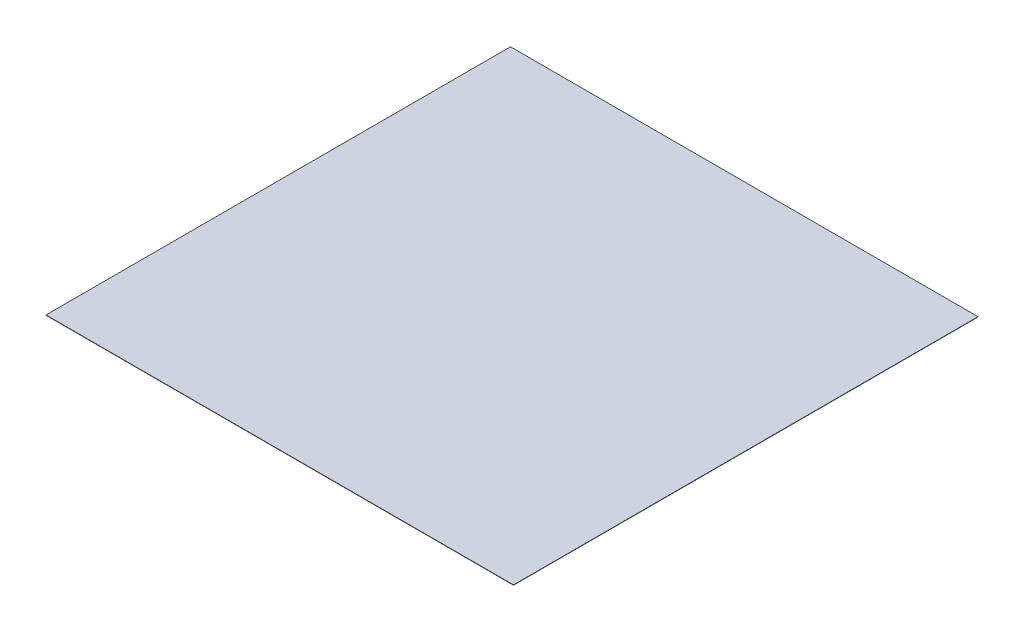
ISO-10303-21;
HEADER;
FILE_DESCRIPTION(('STEP AP214'),'2;1');
FILE_NAME('part.step','',(''),(''),'','','');
FILE_SCHEMA(('AUTOMOTIVE_DESIGN { 1 0 10303 214 1 1 1 1 }'));
ENDSEC;
DATA;
#1=APPLICATION_CONTEXT('core data for automotive mechanical design processes');
#2=APPLICATION_PROTOCOL_DEFINITION('international standard','automotive_design',2000,#1);
#3=PRODUCT_CONTEXT('',#1,'mechanical');
#4=PRODUCT('Part','Part','',(#3));
#5=PRODUCT_RELATED_PRODUCT_CATEGORY('part','',(#4));
#6=PRODUCT_DEFINITION_FORMATION('','',#4);
#7=PRODUCT_DEFINITION_CONTEXT('part definition',#1,'design');
#8=PRODUCT_DEFINITION('design','',#6,#7);
#9=PRODUCT_DEFINITION_SHAPE('','',#8);
#10=(LENGTH_UNIT() NAMED_UNIT(*) SI_UNIT(.MILLI.,.METRE.));
#11=(NAMED_UNIT(*) PLANE_ANGLE_UNIT() SI_UNIT($,.RADIAN.));
#12=(NAMED_UNIT(*) SI_UNIT($,.STERADIAN.) SOLID_ANGLE_UNIT());
#13=UNCERTAINTY_MEASURE_WITH_UNIT(LENGTH_MEASURE(1.E-05),#10,'distance_accuracy_value','');
#14=(GEOMETRIC_REPRESENTATION_CONTEXT(3) GLOBAL_UNCERTAINTY_ASSIGNED_CONTEXT((#13)) GLOBAL_UNIT_ASSIGNED_CONTEXT((#10,
#11,#12)) REPRESENTATION_CONTEXT('',''));
#15=CARTESIAN_POINT('',(0.,0.,0.));
#16=DIRECTION('',(0.,0.,1.));
#17=DIRECTION('',(1.,0.,0.));
#18=AXIS2_PLACEMENT_3D('',#15,#16,#17);
#19=CARTESIAN_POINT('',(0.,0.,0.));
#20=DIRECTION('',(0.,1.,0.));
#21=DIRECTION('',(1.,0.,0.));
#22=AXIS2_PLACEMENT_3D('',#19,#20,#21);
#23=PLANE('',#22);
#24=DIRECTION('',(-1.,0.,0.));
#25=VECTOR('',#24,1.);
#26=CARTESIAN_POINT('',(76.5,0.,-76.));
#27=LINE('',#26,#25);
#28=CARTESIAN_POINT('',(76.5,0.,-76.));
#29=VERTEX_POINT('',#28);
#30=CARTESIAN_POINT('',(-76.5,0.,-76.));
#31=VERTEX_POINT('',#30);
#32=EDGE_CURVE('E84',#29,#31,#27,.T.);
#33=ORIENTED_EDGE('',*,*,#32,.F.);
#34=DIRECTION('',(0.,0.,-1.));
#35=VECTOR('',#34,1.);
#36=CARTESIAN_POINT('',(76.5,0.,76.));
#37=LINE('',#36,#35);
#38=CARTESIAN_POINT('',(76.5,0.,76.));
#39=VERTEX_POINT('',#38);
#40=EDGE_CURVE('E36',#39,#29,#37,.T.);
#41=ORIENTED_EDGE('',*,*,#40,.F.);
#42=DIRECTION('',(1.,0.,0.));
#43=VECTOR('',#42,1.);
#44=CARTESIAN_POINT('',(-76.5,0.,76.));
#45=LINE('',#44,#43);
#46=CARTESIAN_POINT('',(-76.5,0.,76.));
#47=VERTEX_POINT('',#46);
#48=EDGE_CURVE('E73',#47,#39,#45,.T.);
#49=ORIENTED_EDGE('',*,*,#48,.F.);
#50=DIRECTION('',(0.,0.,1.));
#51=VECTOR('',#50,1.);
#52=CARTESIAN_POINT('',(-76.5,0.,-76.));
#53=LINE('',#52,#51);
#54=EDGE_CURVE('E27',#31,#47,#53,.T.);
#55=ORIENTED_EDGE('',*,*,#54,.F.);
#56=EDGE_LOOP('',(#33,#41,#49,#55));
#57=FACE_BOUND('',#56,.T.);
#58=ADVANCED_FACE('F17',(#57),#23,.F.);
#59=CARTESIAN_POINT('',(-76.5,0.,-76.));
#60=DIRECTION('',(-1.,0.,0.));
#61=DIRECTION('',(0.,0.,1.));
#62=AXIS2_PLACEMENT_3D('',#59,#60,#61);
#63=PLANE('',#62);
#64=DIRECTION('',(0.,1.,0.));
#65=VECTOR('',#64,1.);
#66=CARTESIAN_POINT('',(-76.5,0.,76.));
#67=LINE('',#66,#65);
#68=CARTESIAN_POINT('',(-76.5,0.104,76.));
#69=VERTEX_POINT('',#68);
#70=EDGE_CURVE('E11',#47,#69,#67,.T.);
#71=ORIENTED_EDGE('',*,*,#70,.T.);
#72=DIRECTION('',(0.,0.,1.));
#73=VECTOR('',#72,1.);
#74=CARTESIAN_POINT('',(-76.5,0.104,-76.));
#75=LINE('',#74,#73);
#76=CARTESIAN_POINT('',(-76.5,0.104,-76.));
#77=VERTEX_POINT('',#76);
#78=EDGE_CURVE('E74',#77,#69,#75,.T.);
#79=ORIENTED_EDGE('',*,*,#78,.F.);
#80=DIRECTION('',(0.,1.,0.));
#81=VECTOR('',#80,1.);
#82=CARTESIAN_POINT('',(-76.5,0.,-76.));
#83=LINE('',#82,#81);
#84=EDGE_CURVE('E80',#31,#77,#83,.T.);
#85=ORIENTED_EDGE('',*,*,#84,.F.);
#86=ORIENTED_EDGE('',*,*,#54,.T.);
#87=EDGE_LOOP('',(#71,#79,#85,#86));
#88=FACE_BOUND('',#87,.T.);
#89=ADVANCED_FACE('F91',(#88),#63,.T.);
#90=CARTESIAN_POINT('',(76.5,0.,-76.));
#91=DIRECTION('',(0.,0.,-1.));
#92=DIRECTION('',(-1.,0.,0.));
#93=AXIS2_PLACEMENT_3D('',#90,#91,#92);
#94=PLANE('',#93);
#95=ORIENTED_EDGE('',*,*,#84,.T.);
#96=DIRECTION('',(-1.,0.,0.));
#97=VECTOR('',#96,1.);
#98=CARTESIAN_POINT('',(76.5,0.104,-76.));
#99=LINE('',#98,#97);
#100=CARTESIAN_POINT('',(76.5,0.104,-76.));
#101=VERTEX_POINT('',#100);
#102=EDGE_CURVE('E58',#101,#77,#99,.T.);
#103=ORIENTED_EDGE('',*,*,#102,.F.);
#104=DIRECTION('',(0.,1.,0.));
#105=VECTOR('',#104,1.);
#106=CARTESIAN_POINT('',(76.5,0.,-76.));
#107=LINE('',#106,#105);
#108=EDGE_CURVE('E65',#29,#101,#107,.T.);
#109=ORIENTED_EDGE('',*,*,#108,.F.);
#110=ORIENTED_EDGE('',*,*,#32,.T.);
#111=EDGE_LOOP('',(#95,#103,#109,#110));
#112=FACE_BOUND('',#111,.T.);
#113=ADVANCED_FACE('F87',(#112),#94,.T.);
#114=CARTESIAN_POINT('',(76.5,0.,76.));
#115=DIRECTION('',(1.,0.,0.));
#116=DIRECTION('',(0.,0.,-1.));
#117=AXIS2_PLACEMENT_3D('',#114,#115,#116);
#118=PLANE('',#117);
#119=ORIENTED_EDGE('',*,*,#108,.T.);
#120=DIRECTION('',(0.,0.,-1.));
#121=VECTOR('',#120,1.);
#122=CARTESIAN_POINT('',(76.5,0.104,76.));
#123=LINE('',#122,#121);
#124=CARTESIAN_POINT('',(76.5,0.104,76.));
#125=VERTEX_POINT('',#124);
#126=EDGE_CURVE('E61',#125,#101,#123,.T.);
#127=ORIENTED_EDGE('',*,*,#126,.F.);
#128=DIRECTION('',(0.,1.,0.));
#129=VECTOR('',#128,1.);
#130=CARTESIAN_POINT('',(76.5,0.,76.));
#131=LINE('',#130,#129);
#132=EDGE_CURVE('E64',#39,#125,#131,.T.);
#133=ORIENTED_EDGE('',*,*,#132,.F.);
#134=ORIENTED_EDGE('',*,*,#40,.T.);
#135=EDGE_LOOP('',(#119,#127,#133,#134));
#136=FACE_BOUND('',#135,.T.);
#137=ADVANCED_FACE('F63',(#136),#118,.T.);
#138=CARTESIAN_POINT('',(-76.5,0.,76.));
#139=DIRECTION('',(0.,0.,1.));
#140=DIRECTION('',(1.,0.,0.));
#141=AXIS2_PLACEMENT_3D('',#138,#139,#140);
#142=PLANE('',#141);
#143=ORIENTED_EDGE('',*,*,#132,.T.);
#144=DIRECTION('',(1.,0.,0.));
#145=VECTOR('',#144,1.);
#146=CARTESIAN_POINT('',(-76.5,0.104,76.));
#147=LINE('',#146,#145);
#148=EDGE_CURVE('E21',#69,#125,#147,.T.);
#149=ORIENTED_EDGE('',*,*,#148,.F.);
#150=ORIENTED_EDGE('',*,*,#70,.F.);
#151=ORIENTED_EDGE('',*,*,#48,.T.);
#152=EDGE_LOOP('',(#143,#149,#150,#151));
#153=FACE_BOUND('',#152,.T.);
#154=ADVANCED_FACE('F71',(#153),#142,.T.);
#155=CARTESIAN_POINT('',(0.,0.104,0.));
#156=DIRECTION('',(0.,1.,0.));
#157=DIRECTION('',(1.,0.,0.));
#158=AXIS2_PLACEMENT_3D('',#155,#156,#157);
#159=PLANE('',#158);
#160=ORIENTED_EDGE('',*,*,#148,.T.);
#161=ORIENTED_EDGE('',*,*,#126,.T.);
#162=ORIENTED_EDGE('',*,*,#102,.T.);
#163=ORIENTED_EDGE('',*,*,#78,.T.);
#164=EDGE_LOOP('',(#160,#161,#162,#163));
#165=FACE_BOUND('',#164,.T.);
#166=ADVANCED_FACE('F19',(#165),#159,.T.);
#167=CLOSED_SHELL('',(#58,#89,#113,#137,#154,#166));
#168=MANIFOLD_SOLID_BREP('B1',#167);
#169=ADVANCED_BREP_SHAPE_REPRESENTATION('',(#18,#168),#14);
#170=SHAPE_DEFINITION_REPRESENTATION(#9,#169);
ENDSEC;
END-ISO-10303-21;
